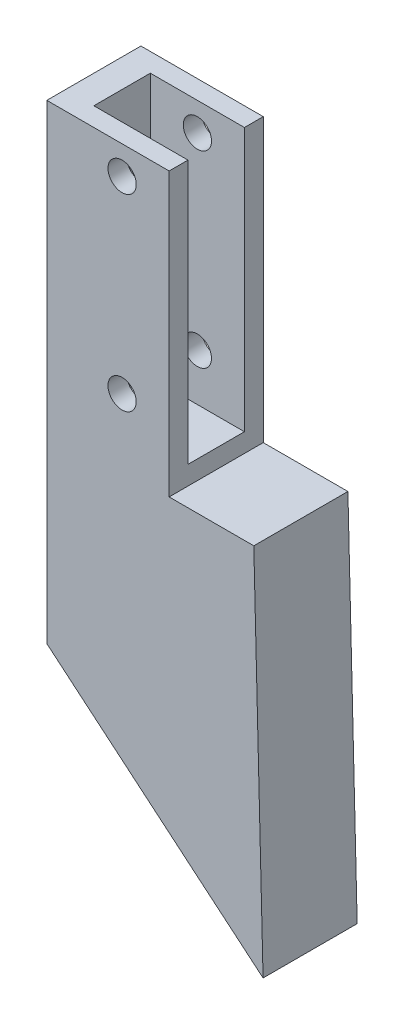
ISO-10303-21;
HEADER;
FILE_DESCRIPTION(('STEP AP214'),'2;1');
FILE_NAME('part.step','',(''),(''),'','','');
FILE_SCHEMA(('AUTOMOTIVE_DESIGN { 1 0 10303 214 1 1 1 1 }'));
ENDSEC;
DATA;
#1=APPLICATION_CONTEXT('core data for automotive mechanical design processes');
#2=APPLICATION_PROTOCOL_DEFINITION('international standard','automotive_design',2000,#1);
#3=PRODUCT_CONTEXT('',#1,'mechanical');
#4=PRODUCT('Part','Part','',(#3));
#5=PRODUCT_RELATED_PRODUCT_CATEGORY('part','',(#4));
#6=PRODUCT_DEFINITION_FORMATION('','',#4);
#7=PRODUCT_DEFINITION_CONTEXT('part definition',#1,'design');
#8=PRODUCT_DEFINITION('design','',#6,#7);
#9=PRODUCT_DEFINITION_SHAPE('','',#8);
#10=(LENGTH_UNIT() NAMED_UNIT(*) SI_UNIT(.MILLI.,.METRE.));
#11=(NAMED_UNIT(*) PLANE_ANGLE_UNIT() SI_UNIT($,.RADIAN.));
#12=(NAMED_UNIT(*) SI_UNIT($,.STERADIAN.) SOLID_ANGLE_UNIT());
#13=UNCERTAINTY_MEASURE_WITH_UNIT(LENGTH_MEASURE(1.E-05),#10,'distance_accuracy_value','');
#14=(GEOMETRIC_REPRESENTATION_CONTEXT(3) GLOBAL_UNCERTAINTY_ASSIGNED_CONTEXT((#13)) GLOBAL_UNIT_ASSIGNED_CONTEXT((#10,
#11,#12)) REPRESENTATION_CONTEXT('',''));
#15=CARTESIAN_POINT('',(0.,0.,0.));
#16=DIRECTION('',(0.,0.,1.));
#17=DIRECTION('',(1.,0.,0.));
#18=AXIS2_PLACEMENT_3D('',#15,#16,#17);
#19=CARTESIAN_POINT('',(-6.5,0.,10.));
#20=DIRECTION('',(-1.,0.,0.));
#21=DIRECTION('',(0.,0.,1.));
#22=AXIS2_PLACEMENT_3D('',#19,#20,#21);
#23=PLANE('',#22);
#24=DIRECTION('',(0.,1.,0.));
#25=VECTOR('',#24,1.);
#26=CARTESIAN_POINT('',(-6.5,0.,0.));
#27=LINE('',#26,#25);
#28=CARTESIAN_POINT('',(-6.49999999999999,-35.,0.));
#29=VERTEX_POINT('',#28);
#30=CARTESIAN_POINT('',(-6.5,15.,0.));
#31=VERTEX_POINT('',#30);
#32=EDGE_CURVE('E147',#29,#31,#27,.T.);
#33=ORIENTED_EDGE('',*,*,#32,.F.);
#34=DIRECTION('',(0.,0.,-1.));
#35=VECTOR('',#34,1.);
#36=CARTESIAN_POINT('',(-6.49999999999999,-35.,10.));
#37=LINE('',#36,#35);
#38=CARTESIAN_POINT('',(-6.49999999999999,-35.,10.));
#39=VERTEX_POINT('',#38);
#40=EDGE_CURVE('E11',#39,#29,#37,.T.);
#41=ORIENTED_EDGE('',*,*,#40,.F.);
#42=DIRECTION('',(0.,1.,0.));
#43=VECTOR('',#42,1.);
#44=CARTESIAN_POINT('',(-6.5,0.,10.));
#45=LINE('',#44,#43);
#46=CARTESIAN_POINT('',(-6.5,15.,10.));
#47=VERTEX_POINT('',#46);
#48=EDGE_CURVE('E166',#39,#47,#45,.T.);
#49=ORIENTED_EDGE('',*,*,#48,.T.);
#50=DIRECTION('',(0.,0.,-1.));
#51=VECTOR('',#50,1.);
#52=CARTESIAN_POINT('',(-6.5,15.,10.));
#53=LINE('',#52,#51);
#54=EDGE_CURVE('E96',#47,#31,#53,.T.);
#55=ORIENTED_EDGE('',*,*,#54,.T.);
#56=EDGE_LOOP('',(#33,#41,#49,#55));
#57=FACE_BOUND('',#56,.T.);
#58=ADVANCED_FACE('F44',(#57),#23,.T.);
#59=CARTESIAN_POINT('',(-19.9197791002961,-23.7394683064611,10.));
#60=DIRECTION('',(0.642787609686537,0.76604444311898,0.));
#61=DIRECTION('',(-0.76604444311898,0.642787609686537,0.));
#62=AXIS2_PLACEMENT_3D('',#59,#60,#61);
#63=PLANE('',#62);
#64=DIRECTION('',(0.76604444311898,-0.642787609686537,0.));
#65=VECTOR('',#64,1.);
#66=CARTESIAN_POINT('',(-19.9197791002961,-23.7394683064611,0.));
#67=LINE('',#66,#65);
#68=CARTESIAN_POINT('',(16.4813332935694,-54.2836282905961,0.));
#69=VERTEX_POINT('',#68);
#70=EDGE_CURVE('E151',#29,#69,#67,.T.);
#71=ORIENTED_EDGE('',*,*,#70,.T.);
#72=DIRECTION('',(0.,0.,-1.));
#73=VECTOR('',#72,1.);
#74=CARTESIAN_POINT('',(16.4813332935694,-54.2836282905961,10.));
#75=LINE('',#74,#73);
#76=CARTESIAN_POINT('',(16.4813332935694,-54.2836282905961,10.));
#77=VERTEX_POINT('',#76);
#78=EDGE_CURVE('E53',#77,#69,#75,.T.);
#79=ORIENTED_EDGE('',*,*,#78,.F.);
#80=DIRECTION('',(0.76604444311898,-0.642787609686537,0.));
#81=VECTOR('',#80,1.);
#82=CARTESIAN_POINT('',(-19.9197791002961,-23.7394683064611,10.));
#83=LINE('',#82,#81);
#84=EDGE_CURVE('E240',#39,#77,#83,.T.);
#85=ORIENTED_EDGE('',*,*,#84,.F.);
#86=ORIENTED_EDGE('',*,*,#40,.T.);
#87=EDGE_LOOP('',(#71,#79,#85,#86));
#88=FACE_BOUND('',#87,.T.);
#89=ADVANCED_FACE('F245',(#88),#63,.F.);
#90=CARTESIAN_POINT('',(15.109705577754,0.37914088984126,10.));
#91=DIRECTION('',(-0.999685330808481,-0.025084644034495,0.));
#92=DIRECTION('',(0.025084644034495,-0.999685330808481,0.));
#93=AXIS2_PLACEMENT_3D('',#90,#91,#92);
#94=PLANE('',#93);
#95=DIRECTION('',(-0.025084644034495,0.999685330808481,0.));
#96=VECTOR('',#95,1.);
#97=CARTESIAN_POINT('',(15.109705577754,0.37914088984126,0.));
#98=LINE('',#97,#96);
#99=CARTESIAN_POINT('',(15.4956072839099,-15.,0.));
#100=VERTEX_POINT('',#99);
#101=EDGE_CURVE('E155',#69,#100,#98,.T.);
#102=ORIENTED_EDGE('',*,*,#101,.T.);
#103=DIRECTION('',(0.,0.,-1.));
#104=VECTOR('',#103,1.);
#105=CARTESIAN_POINT('',(15.4956072839099,-15.,10.));
#106=LINE('',#105,#104);
#107=CARTESIAN_POINT('',(15.4956072839099,-15.,10.));
#108=VERTEX_POINT('',#107);
#109=EDGE_CURVE('E134',#108,#100,#106,.T.);
#110=ORIENTED_EDGE('',*,*,#109,.F.);
#111=DIRECTION('',(-0.025084644034495,0.999685330808481,0.));
#112=VECTOR('',#111,1.);
#113=CARTESIAN_POINT('',(15.109705577754,0.37914088984126,10.));
#114=LINE('',#113,#112);
#115=EDGE_CURVE('E119',#77,#108,#114,.T.);
#116=ORIENTED_EDGE('',*,*,#115,.F.);
#117=ORIENTED_EDGE('',*,*,#78,.T.);
#118=EDGE_LOOP('',(#102,#110,#116,#117));
#119=FACE_BOUND('',#118,.T.);
#120=ADVANCED_FACE('F249',(#119),#94,.F.);
#121=CARTESIAN_POINT('',(0.,-15.,10.));
#122=DIRECTION('',(0.,-1.,0.));
#123=DIRECTION('',(0.,0.,-1.));
#124=AXIS2_PLACEMENT_3D('',#121,#122,#123);
#125=PLANE('',#124);
#126=DIRECTION('',(-1.,0.,0.));
#127=VECTOR('',#126,1.);
#128=CARTESIAN_POINT('',(0.,-15.,0.));
#129=LINE('',#128,#127);
#130=CARTESIAN_POINT('',(6.5,-15.,0.));
#131=VERTEX_POINT('',#130);
#132=EDGE_CURVE('E129',#100,#131,#129,.T.);
#133=ORIENTED_EDGE('',*,*,#132,.T.);
#134=DIRECTION('',(0.,0.,-1.));
#135=VECTOR('',#134,1.);
#136=CARTESIAN_POINT('',(6.5,-15.,10.));
#137=LINE('',#136,#135);
#138=CARTESIAN_POINT('',(6.5,-15.,10.));
#139=VERTEX_POINT('',#138);
#140=EDGE_CURVE('E126',#139,#131,#137,.T.);
#141=ORIENTED_EDGE('',*,*,#140,.F.);
#142=DIRECTION('',(-1.,0.,0.));
#143=VECTOR('',#142,1.);
#144=CARTESIAN_POINT('',(0.,-15.,10.));
#145=LINE('',#144,#143);
#146=EDGE_CURVE('E112',#108,#139,#145,.T.);
#147=ORIENTED_EDGE('',*,*,#146,.F.);
#148=ORIENTED_EDGE('',*,*,#109,.T.);
#149=EDGE_LOOP('',(#133,#141,#147,#148));
#150=FACE_BOUND('',#149,.T.);
#151=ADVANCED_FACE('F127',(#150),#125,.F.);
#152=CARTESIAN_POINT('',(6.5,0.,10.));
#153=DIRECTION('',(-1.,0.,0.));
#154=DIRECTION('',(0.,0.,1.));
#155=AXIS2_PLACEMENT_3D('',#152,#153,#154);
#156=PLANE('',#155);
#157=DIRECTION('',(0.,0.,-1.));
#158=VECTOR('',#157,1.);
#159=CARTESIAN_POINT('',(6.5,-13.,2.));
#160=LINE('',#159,#158);
#161=CARTESIAN_POINT('',(6.5,-13.,8.));
#162=VERTEX_POINT('',#161);
#163=CARTESIAN_POINT('',(6.5,-13.,2.));
#164=VERTEX_POINT('',#163);
#165=EDGE_CURVE('E217',#162,#164,#160,.T.);
#166=ORIENTED_EDGE('',*,*,#165,.F.);
#167=DIRECTION('',(0.,-1.,0.));
#168=VECTOR('',#167,1.);
#169=CARTESIAN_POINT('',(6.5,-13.,8.));
#170=LINE('',#169,#168);
#171=CARTESIAN_POINT('',(6.5,15.,8.));
#172=VERTEX_POINT('',#171);
#173=EDGE_CURVE('E186',#172,#162,#170,.T.);
#174=ORIENTED_EDGE('',*,*,#173,.F.);
#175=DIRECTION('',(0.,0.,-1.));
#176=VECTOR('',#175,1.);
#177=CARTESIAN_POINT('',(6.5,15.,10.));
#178=LINE('',#177,#176);
#179=CARTESIAN_POINT('',(6.5,15.,10.));
#180=VERTEX_POINT('',#179);
#181=EDGE_CURVE('E135',#180,#172,#178,.T.);
#182=ORIENTED_EDGE('',*,*,#181,.F.);
#183=DIRECTION('',(0.,1.,0.));
#184=VECTOR('',#183,1.);
#185=CARTESIAN_POINT('',(6.5,0.,10.));
#186=LINE('',#185,#184);
#187=EDGE_CURVE('E116',#139,#180,#186,.T.);
#188=ORIENTED_EDGE('',*,*,#187,.F.);
#189=ORIENTED_EDGE('',*,*,#140,.T.);
#190=DIRECTION('',(0.,1.,0.));
#191=VECTOR('',#190,1.);
#192=CARTESIAN_POINT('',(6.5,0.,0.));
#193=LINE('',#192,#191);
#194=CARTESIAN_POINT('',(6.5,15.,0.));
#195=VERTEX_POINT('',#194);
#196=EDGE_CURVE('E160',#131,#195,#193,.T.);
#197=ORIENTED_EDGE('',*,*,#196,.T.);
#198=CARTESIAN_POINT('',(6.5,15.,2.));
#199=VERTEX_POINT('',#198);
#200=EDGE_CURVE('E169',#199,#195,#178,.T.);
#201=ORIENTED_EDGE('',*,*,#200,.F.);
#202=DIRECTION('',(0.,1.,0.));
#203=VECTOR('',#202,1.);
#204=CARTESIAN_POINT('',(6.5,-13.,2.));
#205=LINE('',#204,#203);
#206=EDGE_CURVE('E205',#164,#199,#205,.T.);
#207=ORIENTED_EDGE('',*,*,#206,.F.);
#208=EDGE_LOOP('',(#166,#174,#182,#188,#189,#197,#201,#207));
#209=FACE_BOUND('',#208,.T.);
#210=ADVANCED_FACE('F138',(#209),#156,.F.);
#211=CARTESIAN_POINT('',(0.,15.,10.));
#212=DIRECTION('',(0.,-1.,0.));
#213=DIRECTION('',(0.,0.,-1.));
#214=AXIS2_PLACEMENT_3D('',#211,#212,#213);
#215=PLANE('',#214);
#216=ORIENTED_EDGE('',*,*,#181,.T.);
#217=DIRECTION('',(1.,0.,0.));
#218=VECTOR('',#217,1.);
#219=CARTESIAN_POINT('',(-3.5,15.,8.));
#220=LINE('',#219,#218);
#221=CARTESIAN_POINT('',(-3.5,15.,8.));
#222=VERTEX_POINT('',#221);
#223=EDGE_CURVE('E152',#222,#172,#220,.T.);
#224=ORIENTED_EDGE('',*,*,#223,.F.);
#225=DIRECTION('',(0.,0.,1.));
#226=VECTOR('',#225,1.);
#227=CARTESIAN_POINT('',(-3.5,15.,2.));
#228=LINE('',#227,#226);
#229=CARTESIAN_POINT('',(-3.5,15.,2.));
#230=VERTEX_POINT('',#229);
#231=EDGE_CURVE('E210',#230,#222,#228,.T.);
#232=ORIENTED_EDGE('',*,*,#231,.F.);
#233=DIRECTION('',(1.,0.,0.));
#234=VECTOR('',#233,1.);
#235=CARTESIAN_POINT('',(-3.5,15.,2.));
#236=LINE('',#235,#234);
#237=EDGE_CURVE('E227',#230,#199,#236,.T.);
#238=ORIENTED_EDGE('',*,*,#237,.T.);
#239=ORIENTED_EDGE('',*,*,#200,.T.);
#240=DIRECTION('',(-1.,0.,0.));
#241=VECTOR('',#240,1.);
#242=CARTESIAN_POINT('',(0.,15.,0.));
#243=LINE('',#242,#241);
#244=EDGE_CURVE('E163',#195,#31,#243,.T.);
#245=ORIENTED_EDGE('',*,*,#244,.T.);
#246=ORIENTED_EDGE('',*,*,#54,.F.);
#247=DIRECTION('',(-1.,0.,0.));
#248=VECTOR('',#247,1.);
#249=CARTESIAN_POINT('',(0.,15.,10.));
#250=LINE('',#249,#248);
#251=EDGE_CURVE('E70',#180,#47,#250,.T.);
#252=ORIENTED_EDGE('',*,*,#251,.F.);
#253=EDGE_LOOP('',(#216,#224,#232,#238,#239,#245,#246,#252));
#254=FACE_BOUND('',#253,.T.);
#255=ADVANCED_FACE('F259',(#254),#215,.F.);
#256=CARTESIAN_POINT('',(0.,0.,10.));
#257=DIRECTION('',(0.,0.,1.));
#258=DIRECTION('',(1.,0.,0.));
#259=AXIS2_PLACEMENT_3D('',#256,#257,#258);
#260=PLANE('',#259);
#261=CARTESIAN_POINT('',(1.5,-8.00000000000001,10.));
#262=DIRECTION('',(0.,0.,1.));
#263=DIRECTION('',(1.,0.,0.));
#264=AXIS2_PLACEMENT_3D('',#261,#262,#263);
#265=CIRCLE('',#264,1.5);
#266=CARTESIAN_POINT('',(3.,-8.00000000000001,10.));
#267=VERTEX_POINT('',#266);
#268=EDGE_CURVE('E328',#267,#267,#265,.T.);
#269=ORIENTED_EDGE('',*,*,#268,.F.);
#270=EDGE_LOOP('',(#269));
#271=FACE_BOUND('',#270,.T.);
#272=CARTESIAN_POINT('',(1.5,12.,10.));
#273=DIRECTION('',(0.,0.,1.));
#274=DIRECTION('',(1.,0.,0.));
#275=AXIS2_PLACEMENT_3D('',#272,#273,#274);
#276=CIRCLE('',#275,1.5);
#277=CARTESIAN_POINT('',(3.,12.,10.));
#278=VERTEX_POINT('',#277);
#279=EDGE_CURVE('E189',#278,#278,#276,.T.);
#280=ORIENTED_EDGE('',*,*,#279,.F.);
#281=EDGE_LOOP('',(#280));
#282=FACE_BOUND('',#281,.T.);
#283=ORIENTED_EDGE('',*,*,#48,.F.);
#284=ORIENTED_EDGE('',*,*,#84,.T.);
#285=ORIENTED_EDGE('',*,*,#115,.T.);
#286=ORIENTED_EDGE('',*,*,#146,.T.);
#287=ORIENTED_EDGE('',*,*,#187,.T.);
#288=ORIENTED_EDGE('',*,*,#251,.T.);
#289=EDGE_LOOP('',(#283,#284,#285,#286,#287,#288));
#290=FACE_BOUND('',#289,.T.);
#291=ADVANCED_FACE('F114',(#271,#282,#290),#260,.T.);
#292=CARTESIAN_POINT('',(0.,0.,0.));
#293=DIRECTION('',(0.,0.,1.));
#294=DIRECTION('',(1.,0.,0.));
#295=AXIS2_PLACEMENT_3D('',#292,#293,#294);
#296=PLANE('',#295);
#297=CARTESIAN_POINT('',(1.5,-8.00000000000001,0.));
#298=DIRECTION('',(0.,0.,1.));
#299=DIRECTION('',(1.,0.,0.));
#300=AXIS2_PLACEMENT_3D('',#297,#298,#299);
#301=CIRCLE('',#300,1.5);
#302=CARTESIAN_POINT('',(3.,-8.00000000000001,0.));
#303=VERTEX_POINT('',#302);
#304=EDGE_CURVE('E334',#303,#303,#301,.T.);
#305=ORIENTED_EDGE('',*,*,#304,.T.);
#306=EDGE_LOOP('',(#305));
#307=FACE_BOUND('',#306,.T.);
#308=CARTESIAN_POINT('',(1.5,12.,0.));
#309=DIRECTION('',(0.,0.,1.));
#310=DIRECTION('',(1.,0.,0.));
#311=AXIS2_PLACEMENT_3D('',#308,#309,#310);
#312=CIRCLE('',#311,1.5);
#313=CARTESIAN_POINT('',(3.,12.,0.));
#314=VERTEX_POINT('',#313);
#315=EDGE_CURVE('E180',#314,#314,#312,.T.);
#316=ORIENTED_EDGE('',*,*,#315,.T.);
#317=EDGE_LOOP('',(#316));
#318=FACE_BOUND('',#317,.T.);
#319=ORIENTED_EDGE('',*,*,#32,.T.);
#320=ORIENTED_EDGE('',*,*,#244,.F.);
#321=ORIENTED_EDGE('',*,*,#196,.F.);
#322=ORIENTED_EDGE('',*,*,#132,.F.);
#323=ORIENTED_EDGE('',*,*,#101,.F.);
#324=ORIENTED_EDGE('',*,*,#70,.F.);
#325=EDGE_LOOP('',(#319,#320,#321,#322,#323,#324));
#326=FACE_BOUND('',#325,.T.);
#327=ADVANCED_FACE('F251',(#307,#318,#326),#296,.F.);
#328=CARTESIAN_POINT('',(-3.5,-13.,8.));
#329=DIRECTION('',(0.,0.,1.));
#330=DIRECTION('',(1.,0.,0.));
#331=AXIS2_PLACEMENT_3D('',#328,#329,#330);
#332=PLANE('',#331);
#333=CARTESIAN_POINT('',(1.5,-8.00000000000001,8.));
#334=DIRECTION('',(0.,0.,1.));
#335=DIRECTION('',(1.,0.,0.));
#336=AXIS2_PLACEMENT_3D('',#333,#334,#335);
#337=CIRCLE('',#336,1.5);
#338=CARTESIAN_POINT('',(3.,-8.00000000000001,8.));
#339=VERTEX_POINT('',#338);
#340=EDGE_CURVE('E195',#339,#339,#337,.T.);
#341=ORIENTED_EDGE('',*,*,#340,.T.);
#342=EDGE_LOOP('',(#341));
#343=FACE_BOUND('',#342,.T.);
#344=CARTESIAN_POINT('',(1.5,12.,8.));
#345=DIRECTION('',(0.,0.,1.));
#346=DIRECTION('',(1.,0.,0.));
#347=AXIS2_PLACEMENT_3D('',#344,#345,#346);
#348=CIRCLE('',#347,1.5);
#349=CARTESIAN_POINT('',(3.,12.,8.));
#350=VERTEX_POINT('',#349);
#351=EDGE_CURVE('E179',#350,#350,#348,.T.);
#352=ORIENTED_EDGE('',*,*,#351,.T.);
#353=EDGE_LOOP('',(#352));
#354=FACE_BOUND('',#353,.T.);
#355=ORIENTED_EDGE('',*,*,#173,.T.);
#356=DIRECTION('',(1.,0.,0.));
#357=VECTOR('',#356,1.);
#358=CARTESIAN_POINT('',(-3.5,-13.,8.));
#359=LINE('',#358,#357);
#360=CARTESIAN_POINT('',(-3.5,-13.,8.));
#361=VERTEX_POINT('',#360);
#362=EDGE_CURVE('E213',#361,#162,#359,.T.);
#363=ORIENTED_EDGE('',*,*,#362,.F.);
#364=DIRECTION('',(0.,-1.,0.));
#365=VECTOR('',#364,1.);
#366=CARTESIAN_POINT('',(-3.5,-13.,8.));
#367=LINE('',#366,#365);
#368=EDGE_CURVE('E200',#222,#361,#367,.T.);
#369=ORIENTED_EDGE('',*,*,#368,.F.);
#370=ORIENTED_EDGE('',*,*,#223,.T.);
#371=EDGE_LOOP('',(#355,#363,#369,#370));
#372=FACE_BOUND('',#371,.T.);
#373=ADVANCED_FACE('F279',(#343,#354,#372),#332,.F.);
#374=CARTESIAN_POINT('',(-3.5,-13.,2.));
#375=DIRECTION('',(0.,0.,-1.));
#376=DIRECTION('',(-1.,0.,0.));
#377=AXIS2_PLACEMENT_3D('',#374,#375,#376);
#378=PLANE('',#377);
#379=CARTESIAN_POINT('',(1.5,-8.00000000000001,2.));
#380=DIRECTION('',(0.,0.,-1.));
#381=DIRECTION('',(-1.,0.,0.));
#382=AXIS2_PLACEMENT_3D('',#379,#380,#381);
#383=CIRCLE('',#382,1.5);
#384=CARTESIAN_POINT('',(0.,-8.00000000000001,2.));
#385=VERTEX_POINT('',#384);
#386=EDGE_CURVE('E47',#385,#385,#383,.T.);
#387=ORIENTED_EDGE('',*,*,#386,.T.);
#388=EDGE_LOOP('',(#387));
#389=FACE_BOUND('',#388,.T.);
#390=CARTESIAN_POINT('',(1.5,12.,2.));
#391=DIRECTION('',(0.,0.,-1.));
#392=DIRECTION('',(-1.,0.,0.));
#393=AXIS2_PLACEMENT_3D('',#390,#391,#392);
#394=CIRCLE('',#393,1.5);
#395=CARTESIAN_POINT('',(0.,12.,2.));
#396=VERTEX_POINT('',#395);
#397=EDGE_CURVE('E176',#396,#396,#394,.T.);
#398=ORIENTED_EDGE('',*,*,#397,.T.);
#399=EDGE_LOOP('',(#398));
#400=FACE_BOUND('',#399,.T.);
#401=ORIENTED_EDGE('',*,*,#206,.T.);
#402=ORIENTED_EDGE('',*,*,#237,.F.);
#403=DIRECTION('',(0.,1.,0.));
#404=VECTOR('',#403,1.);
#405=CARTESIAN_POINT('',(-3.5,-13.,2.));
#406=LINE('',#405,#404);
#407=CARTESIAN_POINT('',(-3.5,-13.,2.));
#408=VERTEX_POINT('',#407);
#409=EDGE_CURVE('E61',#408,#230,#406,.T.);
#410=ORIENTED_EDGE('',*,*,#409,.F.);
#411=DIRECTION('',(1.,0.,0.));
#412=VECTOR('',#411,1.);
#413=CARTESIAN_POINT('',(-3.5,-13.,2.));
#414=LINE('',#413,#412);
#415=EDGE_CURVE('E231',#408,#164,#414,.T.);
#416=ORIENTED_EDGE('',*,*,#415,.T.);
#417=EDGE_LOOP('',(#401,#402,#410,#416));
#418=FACE_BOUND('',#417,.T.);
#419=ADVANCED_FACE('F263',(#389,#400,#418),#378,.F.);
#420=CARTESIAN_POINT('',(-3.5,-13.,2.));
#421=DIRECTION('',(0.,-1.,0.));
#422=DIRECTION('',(0.,0.,-1.));
#423=AXIS2_PLACEMENT_3D('',#420,#421,#422);
#424=PLANE('',#423);
#425=ORIENTED_EDGE('',*,*,#165,.T.);
#426=ORIENTED_EDGE('',*,*,#415,.F.);
#427=DIRECTION('',(0.,0.,-1.));
#428=VECTOR('',#427,1.);
#429=CARTESIAN_POINT('',(-3.5,-13.,2.));
#430=LINE('',#429,#428);
#431=EDGE_CURVE('E204',#361,#408,#430,.T.);
#432=ORIENTED_EDGE('',*,*,#431,.F.);
#433=ORIENTED_EDGE('',*,*,#362,.T.);
#434=EDGE_LOOP('',(#425,#426,#432,#433));
#435=FACE_BOUND('',#434,.T.);
#436=ADVANCED_FACE('F270',(#435),#424,.F.);
#437=CARTESIAN_POINT('',(-3.5,0.,0.));
#438=DIRECTION('',(1.,0.,0.));
#439=DIRECTION('',(0.,0.,-1.));
#440=AXIS2_PLACEMENT_3D('',#437,#438,#439);
#441=PLANE('',#440);
#442=ORIENTED_EDGE('',*,*,#368,.T.);
#443=ORIENTED_EDGE('',*,*,#431,.T.);
#444=ORIENTED_EDGE('',*,*,#409,.T.);
#445=ORIENTED_EDGE('',*,*,#231,.T.);
#446=EDGE_LOOP('',(#442,#443,#444,#445));
#447=FACE_BOUND('',#446,.T.);
#448=ADVANCED_FACE('F306',(#447),#441,.T.);
#449=CARTESIAN_POINT('',(1.5,12.,0.));
#450=DIRECTION('',(0.,0.,1.));
#451=DIRECTION('',(1.,0.,0.));
#452=AXIS2_PLACEMENT_3D('',#449,#450,#451);
#453=CYLINDRICAL_SURFACE('',#452,1.5);
#454=ORIENTED_EDGE('',*,*,#315,.F.);
#455=EDGE_LOOP('',(#454));
#456=FACE_BOUND('',#455,.T.);
#457=ORIENTED_EDGE('',*,*,#397,.F.);
#458=EDGE_LOOP('',(#457));
#459=FACE_BOUND('',#458,.T.);
#460=ADVANCED_FACE('F312',(#456,#459),#453,.F.);
#461=ORIENTED_EDGE('',*,*,#279,.T.);
#462=EDGE_LOOP('',(#461));
#463=FACE_BOUND('',#462,.T.);
#464=ORIENTED_EDGE('',*,*,#351,.F.);
#465=EDGE_LOOP('',(#464));
#466=FACE_BOUND('',#465,.T.);
#467=ADVANCED_FACE('F313',(#463,#466),#453,.F.);
#468=CARTESIAN_POINT('',(1.5,-8.00000000000001,0.));
#469=DIRECTION('',(0.,0.,1.));
#470=DIRECTION('',(1.,0.,0.));
#471=AXIS2_PLACEMENT_3D('',#468,#469,#470);
#472=CYLINDRICAL_SURFACE('',#471,1.5);
#473=ORIENTED_EDGE('',*,*,#304,.F.);
#474=EDGE_LOOP('',(#473));
#475=FACE_BOUND('',#474,.T.);
#476=ORIENTED_EDGE('',*,*,#386,.F.);
#477=EDGE_LOOP('',(#476));
#478=FACE_BOUND('',#477,.T.);
#479=ADVANCED_FACE('F316',(#475,#478),#472,.F.);
#480=ORIENTED_EDGE('',*,*,#268,.T.);
#481=EDGE_LOOP('',(#480));
#482=FACE_BOUND('',#481,.T.);
#483=ORIENTED_EDGE('',*,*,#340,.F.);
#484=EDGE_LOOP('',(#483));
#485=FACE_BOUND('',#484,.T.);
#486=ADVANCED_FACE('F318',(#482,#485),#472,.F.);
#487=CLOSED_SHELL('',(#58,#89,#120,#151,#210,#255,#291,#327,#373,#419,#436,#448,#460,#467,#479,#486));
#488=MANIFOLD_SOLID_BREP('B2',#487);
#489=ADVANCED_BREP_SHAPE_REPRESENTATION('',(#18,#488),#14);
#490=SHAPE_DEFINITION_REPRESENTATION(#9,#489);
ENDSEC;
END-ISO-10303-21;
